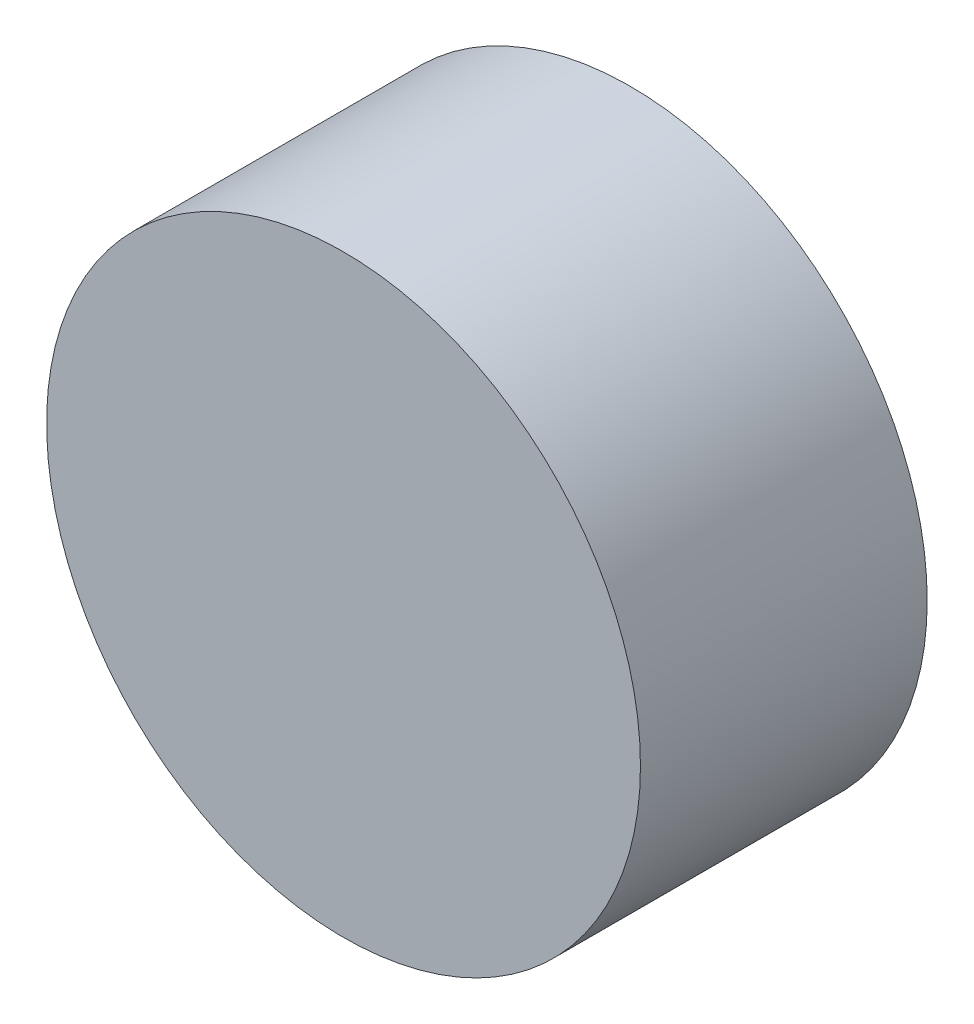
ISO-10303-21;
HEADER;
FILE_DESCRIPTION(('STEP AP214'),'2;1');
FILE_NAME('part.step','',(''),(''),'','','');
FILE_SCHEMA(('AUTOMOTIVE_DESIGN { 1 0 10303 214 1 1 1 1 }'));
ENDSEC;
DATA;
#1=APPLICATION_CONTEXT('core data for automotive mechanical design processes');
#2=APPLICATION_PROTOCOL_DEFINITION('international standard','automotive_design',2000,#1);
#3=PRODUCT_CONTEXT('',#1,'mechanical');
#4=PRODUCT('Part','Part','',(#3));
#5=PRODUCT_RELATED_PRODUCT_CATEGORY('part','',(#4));
#6=PRODUCT_DEFINITION_FORMATION('','',#4);
#7=PRODUCT_DEFINITION_CONTEXT('part definition',#1,'design');
#8=PRODUCT_DEFINITION('design','',#6,#7);
#9=PRODUCT_DEFINITION_SHAPE('','',#8);
#10=(LENGTH_UNIT() NAMED_UNIT(*) SI_UNIT(.MILLI.,.METRE.));
#11=(NAMED_UNIT(*) PLANE_ANGLE_UNIT() SI_UNIT($,.RADIAN.));
#12=(NAMED_UNIT(*) SI_UNIT($,.STERADIAN.) SOLID_ANGLE_UNIT());
#13=UNCERTAINTY_MEASURE_WITH_UNIT(LENGTH_MEASURE(1.E-05),#10,'distance_accuracy_value','');
#14=(GEOMETRIC_REPRESENTATION_CONTEXT(3) GLOBAL_UNCERTAINTY_ASSIGNED_CONTEXT((#13)) GLOBAL_UNIT_ASSIGNED_CONTEXT((#10,
#11,#12)) REPRESENTATION_CONTEXT('',''));
#15=CARTESIAN_POINT('',(0.,0.,0.));
#16=DIRECTION('',(0.,0.,1.));
#17=DIRECTION('',(1.,0.,0.));
#18=AXIS2_PLACEMENT_3D('',#15,#16,#17);
#19=CARTESIAN_POINT('',(0.,0.,33.8));
#20=DIRECTION('',(0.,0.,-1.));
#21=DIRECTION('',(-1.,0.,0.));
#22=AXIS2_PLACEMENT_3D('',#19,#20,#21);
#23=CYLINDRICAL_SURFACE('',#22,35.);
#24=CARTESIAN_POINT('',(0.,0.,33.8));
#25=DIRECTION('',(0.,0.,1.));
#26=DIRECTION('',(1.,0.,0.));
#27=AXIS2_PLACEMENT_3D('',#24,#25,#26);
#28=CIRCLE('',#27,35.);
#29=CARTESIAN_POINT('',(35.,0.,33.8));
#30=VERTEX_POINT('',#29);
#31=EDGE_CURVE('E10',#30,#30,#28,.T.);
#32=ORIENTED_EDGE('',*,*,#31,.F.);
#33=EDGE_LOOP('',(#32));
#34=FACE_BOUND('',#33,.T.);
#35=CARTESIAN_POINT('',(0.,0.,0.));
#36=DIRECTION('',(0.,0.,1.));
#37=DIRECTION('',(1.,0.,0.));
#38=AXIS2_PLACEMENT_3D('',#35,#36,#37);
#39=CIRCLE('',#38,35.);
#40=CARTESIAN_POINT('',(35.,0.,0.));
#41=VERTEX_POINT('',#40);
#42=EDGE_CURVE('E38',#41,#41,#39,.T.);
#43=ORIENTED_EDGE('',*,*,#42,.T.);
#44=EDGE_LOOP('',(#43));
#45=FACE_BOUND('',#44,.T.);
#46=ADVANCED_FACE('F35',(#34,#45),#23,.T.);
#47=CARTESIAN_POINT('',(0.,0.,33.8));
#48=DIRECTION('',(0.,0.,1.));
#49=DIRECTION('',(1.,0.,0.));
#50=AXIS2_PLACEMENT_3D('',#47,#48,#49);
#51=PLANE('',#50);
#52=ORIENTED_EDGE('',*,*,#31,.T.);
#53=EDGE_LOOP('',(#52));
#54=FACE_BOUND('',#53,.T.);
#55=ADVANCED_FACE('F50',(#54),#51,.T.);
#56=CARTESIAN_POINT('',(0.,0.,0.));
#57=DIRECTION('',(0.,0.,1.));
#58=DIRECTION('',(1.,0.,0.));
#59=AXIS2_PLACEMENT_3D('',#56,#57,#58);
#60=PLANE('',#59);
#61=ORIENTED_EDGE('',*,*,#42,.F.);
#62=EDGE_LOOP('',(#61));
#63=FACE_BOUND('',#62,.T.);
#64=ADVANCED_FACE('F48',(#63),#60,.F.);
#65=CLOSED_SHELL('',(#46,#55,#64));
#66=MANIFOLD_SOLID_BREP('B2',#65);
#67=ADVANCED_BREP_SHAPE_REPRESENTATION('',(#18,#66),#14);
#68=SHAPE_DEFINITION_REPRESENTATION(#9,#67);
ENDSEC;
END-ISO-10303-21;
